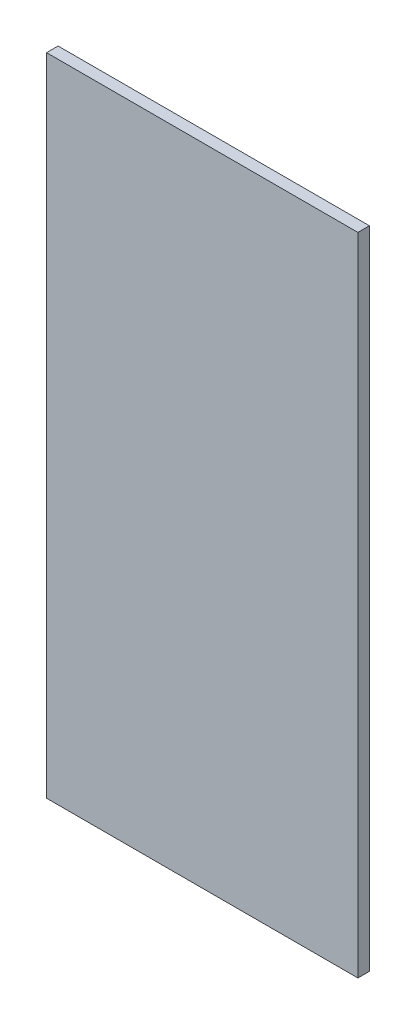
ISO-10303-21;
HEADER;
FILE_DESCRIPTION(('STEP AP214'),'2;1');
FILE_NAME('part.step','',(''),(''),'','','');
FILE_SCHEMA(('AUTOMOTIVE_DESIGN { 1 0 10303 214 1 1 1 1 }'));
ENDSEC;
DATA;
#1=APPLICATION_CONTEXT('core data for automotive mechanical design processes');
#2=APPLICATION_PROTOCOL_DEFINITION('international standard','automotive_design',2000,#1);
#3=PRODUCT_CONTEXT('',#1,'mechanical');
#4=PRODUCT('Part','Part','',(#3));
#5=PRODUCT_RELATED_PRODUCT_CATEGORY('part','',(#4));
#6=PRODUCT_DEFINITION_FORMATION('','',#4);
#7=PRODUCT_DEFINITION_CONTEXT('part definition',#1,'design');
#8=PRODUCT_DEFINITION('design','',#6,#7);
#9=PRODUCT_DEFINITION_SHAPE('','',#8);
#10=(LENGTH_UNIT() NAMED_UNIT(*) SI_UNIT(.MILLI.,.METRE.));
#11=(NAMED_UNIT(*) PLANE_ANGLE_UNIT() SI_UNIT($,.RADIAN.));
#12=(NAMED_UNIT(*) SI_UNIT($,.STERADIAN.) SOLID_ANGLE_UNIT());
#13=UNCERTAINTY_MEASURE_WITH_UNIT(LENGTH_MEASURE(1.E-05),#10,'distance_accuracy_value','');
#14=(GEOMETRIC_REPRESENTATION_CONTEXT(3) GLOBAL_UNCERTAINTY_ASSIGNED_CONTEXT((#13)) GLOBAL_UNIT_ASSIGNED_CONTEXT((#10,
#11,#12)) REPRESENTATION_CONTEXT('',''));
#15=CARTESIAN_POINT('',(0.,0.,0.));
#16=DIRECTION('',(0.,0.,1.));
#17=DIRECTION('',(1.,0.,0.));
#18=AXIS2_PLACEMENT_3D('',#15,#16,#17);
#19=CARTESIAN_POINT('',(171.45,-355.6,12.7));
#20=DIRECTION('',(-1.,0.,0.));
#21=DIRECTION('',(0.,0.,1.));
#22=AXIS2_PLACEMENT_3D('',#19,#20,#21);
#23=PLANE('',#22);
#24=DIRECTION('',(0.,1.,0.));
#25=VECTOR('',#24,1.);
#26=CARTESIAN_POINT('',(171.45,-355.6,0.));
#27=LINE('',#26,#25);
#28=CARTESIAN_POINT('',(171.45,-355.6,0.));
#29=VERTEX_POINT('',#28);
#30=CARTESIAN_POINT('',(171.45,355.6,0.));
#31=VERTEX_POINT('',#30);
#32=EDGE_CURVE('E96',#29,#31,#27,.T.);
#33=ORIENTED_EDGE('',*,*,#32,.T.);
#34=DIRECTION('',(0.,0.,-1.));
#35=VECTOR('',#34,1.);
#36=CARTESIAN_POINT('',(171.45,355.6,12.7));
#37=LINE('',#36,#35);
#38=CARTESIAN_POINT('',(171.45,355.6,12.7));
#39=VERTEX_POINT('',#38);
#40=EDGE_CURVE('E11',#39,#31,#37,.T.);
#41=ORIENTED_EDGE('',*,*,#40,.F.);
#42=DIRECTION('',(0.,1.,0.));
#43=VECTOR('',#42,1.);
#44=CARTESIAN_POINT('',(171.45,-355.6,12.7));
#45=LINE('',#44,#43);
#46=CARTESIAN_POINT('',(171.45,-355.6,12.7));
#47=VERTEX_POINT('',#46);
#48=EDGE_CURVE('E84',#47,#39,#45,.T.);
#49=ORIENTED_EDGE('',*,*,#48,.F.);
#50=DIRECTION('',(0.,0.,-1.));
#51=VECTOR('',#50,1.);
#52=CARTESIAN_POINT('',(171.45,-355.6,12.7));
#53=LINE('',#52,#51);
#54=EDGE_CURVE('E92',#47,#29,#53,.T.);
#55=ORIENTED_EDGE('',*,*,#54,.T.);
#56=EDGE_LOOP('',(#33,#41,#49,#55));
#57=FACE_BOUND('',#56,.T.);
#58=ADVANCED_FACE('F33',(#57),#23,.F.);
#59=CARTESIAN_POINT('',(-171.45,355.6,12.7));
#60=DIRECTION('',(0.,-1.,0.));
#61=DIRECTION('',(0.,0.,-1.));
#62=AXIS2_PLACEMENT_3D('',#59,#60,#61);
#63=PLANE('',#62);
#64=DIRECTION('',(-1.,0.,0.));
#65=VECTOR('',#64,1.);
#66=CARTESIAN_POINT('',(-171.45,355.6,0.));
#67=LINE('',#66,#65);
#68=CARTESIAN_POINT('',(-171.45,355.6,0.));
#69=VERTEX_POINT('',#68);
#70=EDGE_CURVE('E88',#31,#69,#67,.T.);
#71=ORIENTED_EDGE('',*,*,#70,.T.);
#72=DIRECTION('',(0.,0.,-1.));
#73=VECTOR('',#72,1.);
#74=CARTESIAN_POINT('',(-171.45,355.6,12.7));
#75=LINE('',#74,#73);
#76=CARTESIAN_POINT('',(-171.45,355.6,12.7));
#77=VERTEX_POINT('',#76);
#78=EDGE_CURVE('E41',#77,#69,#75,.T.);
#79=ORIENTED_EDGE('',*,*,#78,.F.);
#80=DIRECTION('',(-1.,0.,0.));
#81=VECTOR('',#80,1.);
#82=CARTESIAN_POINT('',(-171.45,355.6,12.7));
#83=LINE('',#82,#81);
#84=EDGE_CURVE('E79',#39,#77,#83,.T.);
#85=ORIENTED_EDGE('',*,*,#84,.F.);
#86=ORIENTED_EDGE('',*,*,#40,.T.);
#87=EDGE_LOOP('',(#71,#79,#85,#86));
#88=FACE_BOUND('',#87,.T.);
#89=ADVANCED_FACE('F87',(#88),#63,.F.);
#90=CARTESIAN_POINT('',(-171.45,-355.6,12.7));
#91=DIRECTION('',(1.,0.,0.));
#92=DIRECTION('',(0.,0.,-1.));
#93=AXIS2_PLACEMENT_3D('',#90,#91,#92);
#94=PLANE('',#93);
#95=DIRECTION('',(0.,-1.,0.));
#96=VECTOR('',#95,1.);
#97=CARTESIAN_POINT('',(-171.45,-355.6,0.));
#98=LINE('',#97,#96);
#99=CARTESIAN_POINT('',(-171.45,-355.6,0.));
#100=VERTEX_POINT('',#99);
#101=EDGE_CURVE('E66',#69,#100,#98,.T.);
#102=ORIENTED_EDGE('',*,*,#101,.T.);
#103=DIRECTION('',(0.,0.,-1.));
#104=VECTOR('',#103,1.);
#105=CARTESIAN_POINT('',(-171.45,-355.6,12.7));
#106=LINE('',#105,#104);
#107=CARTESIAN_POINT('',(-171.45,-355.6,12.7));
#108=VERTEX_POINT('',#107);
#109=EDGE_CURVE('E89',#108,#100,#106,.T.);
#110=ORIENTED_EDGE('',*,*,#109,.F.);
#111=DIRECTION('',(0.,-1.,0.));
#112=VECTOR('',#111,1.);
#113=CARTESIAN_POINT('',(-171.45,-355.6,12.7));
#114=LINE('',#113,#112);
#115=EDGE_CURVE('E82',#77,#108,#114,.T.);
#116=ORIENTED_EDGE('',*,*,#115,.F.);
#117=ORIENTED_EDGE('',*,*,#78,.T.);
#118=EDGE_LOOP('',(#102,#110,#116,#117));
#119=FACE_BOUND('',#118,.T.);
#120=ADVANCED_FACE('F90',(#119),#94,.F.);
#121=CARTESIAN_POINT('',(-171.45,-355.6,12.7));
#122=DIRECTION('',(0.,1.,0.));
#123=DIRECTION('',(0.,0.,1.));
#124=AXIS2_PLACEMENT_3D('',#121,#122,#123);
#125=PLANE('',#124);
#126=DIRECTION('',(1.,0.,0.));
#127=VECTOR('',#126,1.);
#128=CARTESIAN_POINT('',(-171.45,-355.6,0.));
#129=LINE('',#128,#127);
#130=EDGE_CURVE('E72',#100,#29,#129,.T.);
#131=ORIENTED_EDGE('',*,*,#130,.T.);
#132=ORIENTED_EDGE('',*,*,#54,.F.);
#133=DIRECTION('',(1.,0.,0.));
#134=VECTOR('',#133,1.);
#135=CARTESIAN_POINT('',(-171.45,-355.6,12.7));
#136=LINE('',#135,#134);
#137=EDGE_CURVE('E49',#108,#47,#136,.T.);
#138=ORIENTED_EDGE('',*,*,#137,.F.);
#139=ORIENTED_EDGE('',*,*,#109,.T.);
#140=EDGE_LOOP('',(#131,#132,#138,#139));
#141=FACE_BOUND('',#140,.T.);
#142=ADVANCED_FACE('F103',(#141),#125,.F.);
#143=CARTESIAN_POINT('',(0.,0.,12.7));
#144=DIRECTION('',(0.,0.,-1.));
#145=DIRECTION('',(-1.,0.,0.));
#146=AXIS2_PLACEMENT_3D('',#143,#144,#145);
#147=PLANE('',#146);
#148=ORIENTED_EDGE('',*,*,#48,.T.);
#149=ORIENTED_EDGE('',*,*,#84,.T.);
#150=ORIENTED_EDGE('',*,*,#115,.T.);
#151=ORIENTED_EDGE('',*,*,#137,.T.);
#152=EDGE_LOOP('',(#148,#149,#150,#151));
#153=FACE_BOUND('',#152,.T.);
#154=ADVANCED_FACE('F80',(#153),#147,.F.);
#155=CARTESIAN_POINT('',(0.,0.,0.));
#156=DIRECTION('',(0.,0.,-1.));
#157=DIRECTION('',(-1.,0.,0.));
#158=AXIS2_PLACEMENT_3D('',#155,#156,#157);
#159=PLANE('',#158);
#160=ORIENTED_EDGE('',*,*,#32,.F.);
#161=ORIENTED_EDGE('',*,*,#130,.F.);
#162=ORIENTED_EDGE('',*,*,#101,.F.);
#163=ORIENTED_EDGE('',*,*,#70,.F.);
#164=EDGE_LOOP('',(#160,#161,#162,#163));
#165=FACE_BOUND('',#164,.T.);
#166=ADVANCED_FACE('F106',(#165),#159,.T.);
#167=CLOSED_SHELL('',(#58,#89,#120,#142,#154,#166));
#168=MANIFOLD_SOLID_BREP('B2',#167);
#169=ADVANCED_BREP_SHAPE_REPRESENTATION('',(#18,#168),#14);
#170=SHAPE_DEFINITION_REPRESENTATION(#9,#169);
ENDSEC;
END-ISO-10303-21;
